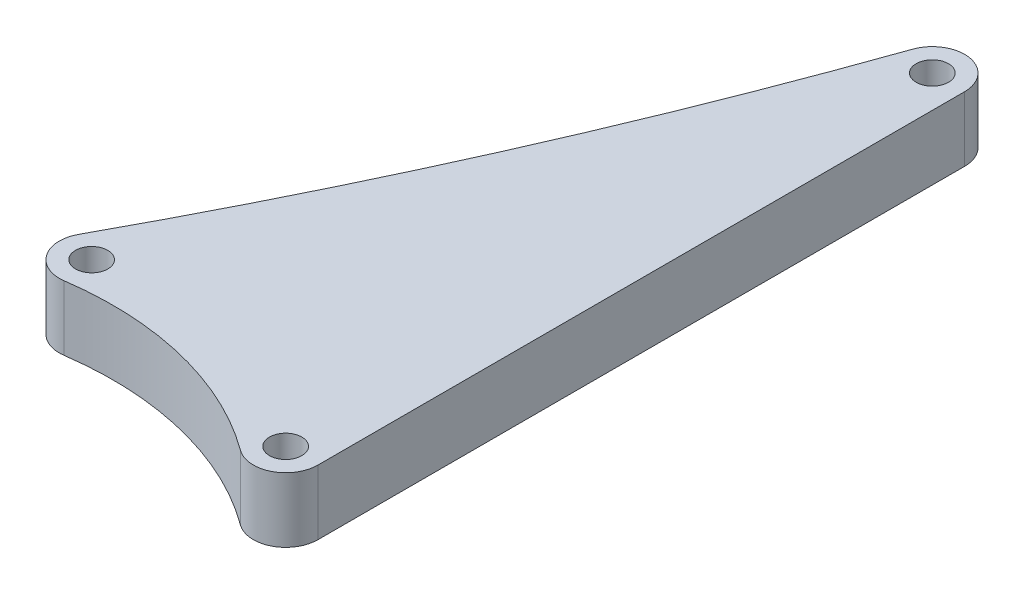
ISO-10303-21;
HEADER;
FILE_DESCRIPTION(('STEP AP214'),'2;1');
FILE_NAME('part.step','',(''),(''),'','','');
FILE_SCHEMA(('AUTOMOTIVE_DESIGN { 1 0 10303 214 1 1 1 1 }'));
ENDSEC;
DATA;
#1=APPLICATION_CONTEXT('core data for automotive mechanical design processes');
#2=APPLICATION_PROTOCOL_DEFINITION('international standard','automotive_design',2000,#1);
#3=PRODUCT_CONTEXT('',#1,'mechanical');
#4=PRODUCT('Part','Part','',(#3));
#5=PRODUCT_RELATED_PRODUCT_CATEGORY('part','',(#4));
#6=PRODUCT_DEFINITION_FORMATION('','',#4);
#7=PRODUCT_DEFINITION_CONTEXT('part definition',#1,'design');
#8=PRODUCT_DEFINITION('design','',#6,#7);
#9=PRODUCT_DEFINITION_SHAPE('','',#8);
#10=(LENGTH_UNIT() NAMED_UNIT(*) SI_UNIT(.MILLI.,.METRE.));
#11=(NAMED_UNIT(*) PLANE_ANGLE_UNIT() SI_UNIT($,.RADIAN.));
#12=(NAMED_UNIT(*) SI_UNIT($,.STERADIAN.) SOLID_ANGLE_UNIT());
#13=UNCERTAINTY_MEASURE_WITH_UNIT(LENGTH_MEASURE(1.E-05),#10,'distance_accuracy_value','');
#14=(GEOMETRIC_REPRESENTATION_CONTEXT(3) GLOBAL_UNCERTAINTY_ASSIGNED_CONTEXT((#13)) GLOBAL_UNIT_ASSIGNED_CONTEXT((#10,
#11,#12)) REPRESENTATION_CONTEXT('',''));
#15=CARTESIAN_POINT('',(0.,0.,0.));
#16=DIRECTION('',(0.,0.,1.));
#17=DIRECTION('',(1.,0.,0.));
#18=AXIS2_PLACEMENT_3D('',#15,#16,#17);
#19=CARTESIAN_POINT('',(0.,5.,5.));
#20=DIRECTION('',(0.,-1.,0.));
#21=DIRECTION('',(0.,0.,-1.));
#22=AXIS2_PLACEMENT_3D('',#19,#20,#21);
#23=CYLINDRICAL_SURFACE('',#22,2.5);
#24=CARTESIAN_POINT('',(0.,0.,5.));
#25=DIRECTION('',(0.,1.,0.));
#26=DIRECTION('',(0.,0.,1.));
#27=AXIS2_PLACEMENT_3D('',#24,#25,#26);
#28=CIRCLE('',#27,2.5);
#29=CARTESIAN_POINT('',(-2.1956521569071,0.,3.80454543964683));
#30=VERTEX_POINT('',#29);
#31=CARTESIAN_POINT('',(0.354457600561463,0.,7.47474439274124));
#32=VERTEX_POINT('',#31);
#33=EDGE_CURVE('E129',#30,#32,#28,.T.);
#34=ORIENTED_EDGE('',*,*,#33,.T.);
#35=DIRECTION('',(0.,-1.,0.));
#36=VECTOR('',#35,1.);
#37=CARTESIAN_POINT('',(0.354457600561463,5.,7.47474439274124));
#38=LINE('',#37,#36);
#39=CARTESIAN_POINT('',(0.354457600561463,5.,7.47474439274124));
#40=VERTEX_POINT('',#39);
#41=EDGE_CURVE('E11',#40,#32,#38,.T.);
#42=ORIENTED_EDGE('',*,*,#41,.F.);
#43=CARTESIAN_POINT('',(0.,5.,5.));
#44=DIRECTION('',(0.,1.,0.));
#45=DIRECTION('',(0.,0.,1.));
#46=AXIS2_PLACEMENT_3D('',#43,#44,#45);
#47=CIRCLE('',#46,2.5);
#48=CARTESIAN_POINT('',(-2.1956521569071,5.,3.80454543964683));
#49=VERTEX_POINT('',#48);
#50=EDGE_CURVE('E160',#49,#40,#47,.T.);
#51=ORIENTED_EDGE('',*,*,#50,.F.);
#52=DIRECTION('',(0.,-1.,0.));
#53=VECTOR('',#52,1.);
#54=CARTESIAN_POINT('',(-2.1956521569071,5.,3.80454543964683));
#55=LINE('',#54,#53);
#56=EDGE_CURVE('E125',#49,#30,#55,.T.);
#57=ORIENTED_EDGE('',*,*,#56,.T.);
#58=EDGE_LOOP('',(#34,#42,#51,#57));
#59=FACE_BOUND('',#58,.T.);
#60=ADVANCED_FACE('F34',(#59),#23,.T.);
#61=CARTESIAN_POINT('',(3.8700471583134,5.,32.0198113667464));
#62=DIRECTION('',(0.,-1.,0.));
#63=DIRECTION('',(0.,0.,-1.));
#64=AXIS2_PLACEMENT_3D('',#61,#62,#63);
#65=CYLINDRICAL_SURFACE('',#64,24.7955577210309);
#66=CARTESIAN_POINT('',(3.8700471583134,0.,32.0198113667464));
#67=DIRECTION('',(0.,1.,0.));
#68=DIRECTION('',(0.,0.,1.));
#69=AXIS2_PLACEMENT_3D('',#66,#67,#68);
#70=CIRCLE('',#69,24.7955577210309);
#71=CARTESIAN_POINT('',(18.5226576970381,0.,12.0167944168604));
#72=VERTEX_POINT('',#71);
#73=EDGE_CURVE('E132',#32,#72,#70,.F.);
#74=ORIENTED_EDGE('',*,*,#73,.T.);
#75=DIRECTION('',(0.,-1.,0.));
#76=VECTOR('',#75,1.);
#77=CARTESIAN_POINT('',(18.5226576970381,5.,12.0167944168604));
#78=LINE('',#77,#76);
#79=CARTESIAN_POINT('',(18.5226576970381,5.,12.0167944168604));
#80=VERTEX_POINT('',#79);
#81=EDGE_CURVE('E43',#80,#72,#78,.T.);
#82=ORIENTED_EDGE('',*,*,#81,.F.);
#83=CARTESIAN_POINT('',(3.8700471583134,5.,32.0198113667464));
#84=DIRECTION('',(0.,1.,0.));
#85=DIRECTION('',(0.,0.,1.));
#86=AXIS2_PLACEMENT_3D('',#83,#84,#85);
#87=CIRCLE('',#86,24.7955577210309);
#88=EDGE_CURVE('E87',#40,#80,#87,.F.);
#89=ORIENTED_EDGE('',*,*,#88,.F.);
#90=ORIENTED_EDGE('',*,*,#41,.T.);
#91=EDGE_LOOP('',(#74,#82,#89,#90));
#92=FACE_BOUND('',#91,.T.);
#93=ADVANCED_FACE('F175',(#92),#65,.F.);
#94=CARTESIAN_POINT('',(20.,5.,10.));
#95=DIRECTION('',(0.,-1.,0.));
#96=DIRECTION('',(0.,0.,-1.));
#97=AXIS2_PLACEMENT_3D('',#94,#95,#96);
#98=CYLINDRICAL_SURFACE('',#97,2.5);
#99=CARTESIAN_POINT('',(20.,0.,10.));
#100=DIRECTION('',(0.,1.,0.));
#101=DIRECTION('',(0.,0.,1.));
#102=AXIS2_PLACEMENT_3D('',#99,#100,#101);
#103=CIRCLE('',#102,2.5);
#104=CARTESIAN_POINT('',(22.5,0.,10.));
#105=VERTEX_POINT('',#104);
#106=EDGE_CURVE('E134',#72,#105,#103,.T.);
#107=ORIENTED_EDGE('',*,*,#106,.T.);
#108=DIRECTION('',(0.,-1.,0.));
#109=VECTOR('',#108,1.);
#110=CARTESIAN_POINT('',(22.5,5.,10.));
#111=LINE('',#110,#109);
#112=CARTESIAN_POINT('',(22.5,5.,10.));
#113=VERTEX_POINT('',#112);
#114=EDGE_CURVE('E103',#113,#105,#111,.T.);
#115=ORIENTED_EDGE('',*,*,#114,.F.);
#116=CARTESIAN_POINT('',(20.,5.,10.));
#117=DIRECTION('',(0.,1.,0.));
#118=DIRECTION('',(0.,0.,1.));
#119=AXIS2_PLACEMENT_3D('',#116,#117,#118);
#120=CIRCLE('',#119,2.5);
#121=EDGE_CURVE('E112',#80,#113,#120,.T.);
#122=ORIENTED_EDGE('',*,*,#121,.F.);
#123=ORIENTED_EDGE('',*,*,#81,.T.);
#124=EDGE_LOOP('',(#107,#115,#122,#123));
#125=FACE_BOUND('',#124,.T.);
#126=ADVANCED_FACE('F152',(#125),#98,.T.);
#127=CARTESIAN_POINT('',(22.5,5.,0.));
#128=DIRECTION('',(1.,0.,0.));
#129=DIRECTION('',(0.,0.,-1.));
#130=AXIS2_PLACEMENT_3D('',#127,#128,#129);
#131=PLANE('',#130);
#132=DIRECTION('',(0.,0.,1.));
#133=VECTOR('',#132,1.);
#134=CARTESIAN_POINT('',(22.5,0.,0.));
#135=LINE('',#134,#133);
#136=CARTESIAN_POINT('',(22.5,0.,-40.));
#137=VERTEX_POINT('',#136);
#138=EDGE_CURVE('E102',#137,#105,#135,.T.);
#139=ORIENTED_EDGE('',*,*,#138,.F.);
#140=DIRECTION('',(0.,-1.,0.));
#141=VECTOR('',#140,1.);
#142=CARTESIAN_POINT('',(22.5,5.,-40.));
#143=LINE('',#142,#141);
#144=CARTESIAN_POINT('',(22.5,5.,-40.));
#145=VERTEX_POINT('',#144);
#146=EDGE_CURVE('E96',#145,#137,#143,.T.);
#147=ORIENTED_EDGE('',*,*,#146,.F.);
#148=DIRECTION('',(0.,0.,1.));
#149=VECTOR('',#148,1.);
#150=CARTESIAN_POINT('',(22.5,5.,0.));
#151=LINE('',#150,#149);
#152=EDGE_CURVE('E100',#145,#113,#151,.T.);
#153=ORIENTED_EDGE('',*,*,#152,.T.);
#154=ORIENTED_EDGE('',*,*,#114,.T.);
#155=EDGE_LOOP('',(#139,#147,#153,#154));
#156=FACE_BOUND('',#155,.T.);
#157=ADVANCED_FACE('F98',(#156),#131,.T.);
#158=CARTESIAN_POINT('',(20.,5.,-40.));
#159=DIRECTION('',(0.,-1.,0.));
#160=DIRECTION('',(0.,0.,-1.));
#161=AXIS2_PLACEMENT_3D('',#158,#159,#160);
#162=CYLINDRICAL_SURFACE('',#161,2.5);
#163=CARTESIAN_POINT('',(20.,0.,-40.));
#164=DIRECTION('',(0.,1.,0.));
#165=DIRECTION('',(0.,0.,1.));
#166=AXIS2_PLACEMENT_3D('',#163,#164,#165);
#167=CIRCLE('',#166,2.5);
#168=CARTESIAN_POINT('',(17.6413389840785,0.,-40.8286846275707));
#169=VERTEX_POINT('',#168);
#170=EDGE_CURVE('E73',#137,#169,#167,.T.);
#171=ORIENTED_EDGE('',*,*,#170,.T.);
#172=DIRECTION('',(0.,-1.,0.));
#173=VECTOR('',#172,1.);
#174=CARTESIAN_POINT('',(17.6413389840785,5.,-40.8286846275707));
#175=LINE('',#174,#173);
#176=CARTESIAN_POINT('',(17.6413389840785,5.,-40.8286846275707));
#177=VERTEX_POINT('',#176);
#178=EDGE_CURVE('E104',#177,#169,#175,.T.);
#179=ORIENTED_EDGE('',*,*,#178,.F.);
#180=CARTESIAN_POINT('',(20.,5.,-40.));
#181=DIRECTION('',(0.,1.,0.));
#182=DIRECTION('',(0.,0.,1.));
#183=AXIS2_PLACEMENT_3D('',#180,#181,#182);
#184=CIRCLE('',#183,2.5);
#185=EDGE_CURVE('E106',#145,#177,#184,.T.);
#186=ORIENTED_EDGE('',*,*,#185,.F.);
#187=ORIENTED_EDGE('',*,*,#146,.T.);
#188=EDGE_LOOP('',(#171,#179,#186,#187));
#189=FACE_BOUND('',#188,.T.);
#190=ADVANCED_FACE('F107',(#189),#162,.T.);
#191=CARTESIAN_POINT('',(20.,5.,10.));
#192=DIRECTION('',(0.,-1.,0.));
#193=DIRECTION('',(0.,0.,-1.));
#194=AXIS2_PLACEMENT_3D('',#191,#192,#193);
#195=CYLINDRICAL_SURFACE('',#194,1.25);
#196=CARTESIAN_POINT('',(20.,5.,10.));
#197=DIRECTION('',(0.,1.,0.));
#198=DIRECTION('',(0.,0.,1.));
#199=AXIS2_PLACEMENT_3D('',#196,#197,#198);
#200=CIRCLE('',#199,1.25);
#201=CARTESIAN_POINT('',(20.,5.,11.25));
#202=VERTEX_POINT('',#201);
#203=EDGE_CURVE('E119',#202,#202,#200,.T.);
#204=ORIENTED_EDGE('',*,*,#203,.T.);
#205=EDGE_LOOP('',(#204));
#206=FACE_BOUND('',#205,.T.);
#207=CARTESIAN_POINT('',(20.,0.,10.));
#208=DIRECTION('',(0.,1.,0.));
#209=DIRECTION('',(0.,0.,1.));
#210=AXIS2_PLACEMENT_3D('',#207,#208,#209);
#211=CIRCLE('',#210,1.25);
#212=CARTESIAN_POINT('',(20.,0.,11.25));
#213=VERTEX_POINT('',#212);
#214=EDGE_CURVE('E140',#213,#213,#211,.T.);
#215=ORIENTED_EDGE('',*,*,#214,.F.);
#216=EDGE_LOOP('',(#215));
#217=FACE_BOUND('',#216,.T.);
#218=ADVANCED_FACE('F163',(#206,#217),#195,.F.);
#219=CARTESIAN_POINT('',(-269.390531310034,5.,-141.673569471126));
#220=DIRECTION('',(0.,-1.,0.));
#221=DIRECTION('',(0.,0.,-1.));
#222=AXIS2_PLACEMENT_3D('',#219,#220,#221);
#223=CYLINDRICAL_SURFACE('',#222,304.231795451505);
#224=CARTESIAN_POINT('',(-269.390531310034,0.,-141.673569471126));
#225=DIRECTION('',(0.,1.,0.));
#226=DIRECTION('',(0.,0.,1.));
#227=AXIS2_PLACEMENT_3D('',#224,#225,#226);
#228=CIRCLE('',#227,304.231795451505);
#229=EDGE_CURVE('E79',#169,#30,#228,.F.);
#230=ORIENTED_EDGE('',*,*,#229,.T.);
#231=ORIENTED_EDGE('',*,*,#56,.F.);
#232=CARTESIAN_POINT('',(-269.390531310034,5.,-141.673569471126));
#233=DIRECTION('',(0.,1.,0.));
#234=DIRECTION('',(0.,0.,1.));
#235=AXIS2_PLACEMENT_3D('',#232,#233,#234);
#236=CIRCLE('',#235,304.231795451505);
#237=EDGE_CURVE('E51',#177,#49,#236,.F.);
#238=ORIENTED_EDGE('',*,*,#237,.F.);
#239=ORIENTED_EDGE('',*,*,#178,.T.);
#240=EDGE_LOOP('',(#230,#231,#238,#239));
#241=FACE_BOUND('',#240,.T.);
#242=ADVANCED_FACE('F161',(#241),#223,.F.);
#243=CARTESIAN_POINT('',(0.,5.,5.));
#244=DIRECTION('',(0.,-1.,0.));
#245=DIRECTION('',(0.,0.,-1.));
#246=AXIS2_PLACEMENT_3D('',#243,#244,#245);
#247=CYLINDRICAL_SURFACE('',#246,1.25);
#248=CARTESIAN_POINT('',(0.,5.,5.));
#249=DIRECTION('',(0.,1.,0.));
#250=DIRECTION('',(0.,0.,1.));
#251=AXIS2_PLACEMENT_3D('',#248,#249,#250);
#252=CIRCLE('',#251,1.25);
#253=CARTESIAN_POINT('',(0.,5.,6.25));
#254=VERTEX_POINT('',#253);
#255=EDGE_CURVE('E146',#254,#254,#252,.T.);
#256=ORIENTED_EDGE('',*,*,#255,.T.);
#257=EDGE_LOOP('',(#256));
#258=FACE_BOUND('',#257,.T.);
#259=CARTESIAN_POINT('',(0.,0.,5.));
#260=DIRECTION('',(0.,1.,0.));
#261=DIRECTION('',(0.,0.,1.));
#262=AXIS2_PLACEMENT_3D('',#259,#260,#261);
#263=CIRCLE('',#262,1.25);
#264=CARTESIAN_POINT('',(0.,0.,6.25));
#265=VERTEX_POINT('',#264);
#266=EDGE_CURVE('E126',#265,#265,#263,.T.);
#267=ORIENTED_EDGE('',*,*,#266,.F.);
#268=EDGE_LOOP('',(#267));
#269=FACE_BOUND('',#268,.T.);
#270=ADVANCED_FACE('F36',(#258,#269),#247,.F.);
#271=CARTESIAN_POINT('',(20.,5.,-40.));
#272=DIRECTION('',(0.,-1.,0.));
#273=DIRECTION('',(0.,0.,-1.));
#274=AXIS2_PLACEMENT_3D('',#271,#272,#273);
#275=CYLINDRICAL_SURFACE('',#274,1.25);
#276=CARTESIAN_POINT('',(20.,5.,-40.));
#277=DIRECTION('',(0.,1.,0.));
#278=DIRECTION('',(0.,0.,1.));
#279=AXIS2_PLACEMENT_3D('',#276,#277,#278);
#280=CIRCLE('',#279,1.25);
#281=CARTESIAN_POINT('',(20.,5.,-38.75));
#282=VERTEX_POINT('',#281);
#283=EDGE_CURVE('E122',#282,#282,#280,.T.);
#284=ORIENTED_EDGE('',*,*,#283,.T.);
#285=EDGE_LOOP('',(#284));
#286=FACE_BOUND('',#285,.T.);
#287=CARTESIAN_POINT('',(20.,0.,-40.));
#288=DIRECTION('',(0.,1.,0.));
#289=DIRECTION('',(0.,0.,1.));
#290=AXIS2_PLACEMENT_3D('',#287,#288,#289);
#291=CIRCLE('',#290,1.25);
#292=CARTESIAN_POINT('',(20.,0.,-38.75));
#293=VERTEX_POINT('',#292);
#294=EDGE_CURVE('E143',#293,#293,#291,.T.);
#295=ORIENTED_EDGE('',*,*,#294,.F.);
#296=EDGE_LOOP('',(#295));
#297=FACE_BOUND('',#296,.T.);
#298=ADVANCED_FACE('F169',(#286,#297),#275,.F.);
#299=CARTESIAN_POINT('',(0.,5.,0.));
#300=DIRECTION('',(0.,1.,0.));
#301=DIRECTION('',(0.,0.,1.));
#302=AXIS2_PLACEMENT_3D('',#299,#300,#301);
#303=PLANE('',#302);
#304=ORIENTED_EDGE('',*,*,#255,.F.);
#305=EDGE_LOOP('',(#304));
#306=FACE_BOUND('',#305,.T.);
#307=ORIENTED_EDGE('',*,*,#50,.T.);
#308=ORIENTED_EDGE('',*,*,#88,.T.);
#309=ORIENTED_EDGE('',*,*,#121,.T.);
#310=ORIENTED_EDGE('',*,*,#152,.F.);
#311=ORIENTED_EDGE('',*,*,#185,.T.);
#312=ORIENTED_EDGE('',*,*,#237,.T.);
#313=EDGE_LOOP('',(#307,#308,#309,#310,#311,#312));
#314=FACE_BOUND('',#313,.T.);
#315=ORIENTED_EDGE('',*,*,#203,.F.);
#316=EDGE_LOOP('',(#315));
#317=FACE_BOUND('',#316,.T.);
#318=ORIENTED_EDGE('',*,*,#283,.F.);
#319=EDGE_LOOP('',(#318));
#320=FACE_BOUND('',#319,.T.);
#321=ADVANCED_FACE('F109',(#306,#314,#317,#320),#303,.T.);
#322=CARTESIAN_POINT('',(0.,0.,0.));
#323=DIRECTION('',(0.,1.,0.));
#324=DIRECTION('',(0.,0.,1.));
#325=AXIS2_PLACEMENT_3D('',#322,#323,#324);
#326=PLANE('',#325);
#327=ORIENTED_EDGE('',*,*,#266,.T.);
#328=EDGE_LOOP('',(#327));
#329=FACE_BOUND('',#328,.T.);
#330=ORIENTED_EDGE('',*,*,#33,.F.);
#331=ORIENTED_EDGE('',*,*,#229,.F.);
#332=ORIENTED_EDGE('',*,*,#170,.F.);
#333=ORIENTED_EDGE('',*,*,#138,.T.);
#334=ORIENTED_EDGE('',*,*,#106,.F.);
#335=ORIENTED_EDGE('',*,*,#73,.F.);
#336=EDGE_LOOP('',(#330,#331,#332,#333,#334,#335));
#337=FACE_BOUND('',#336,.T.);
#338=ORIENTED_EDGE('',*,*,#214,.T.);
#339=EDGE_LOOP('',(#338));
#340=FACE_BOUND('',#339,.T.);
#341=ORIENTED_EDGE('',*,*,#294,.T.);
#342=EDGE_LOOP('',(#341));
#343=FACE_BOUND('',#342,.T.);
#344=ADVANCED_FACE('F155',(#329,#337,#340,#343),#326,.F.);
#345=CLOSED_SHELL('',(#60,#93,#126,#157,#190,#218,#242,#270,#298,#321,#344));
#346=MANIFOLD_SOLID_BREP('B2',#345);
#347=ADVANCED_BREP_SHAPE_REPRESENTATION('',(#18,#346),#14);
#348=SHAPE_DEFINITION_REPRESENTATION(#9,#347);
ENDSEC;
END-ISO-10303-21;
